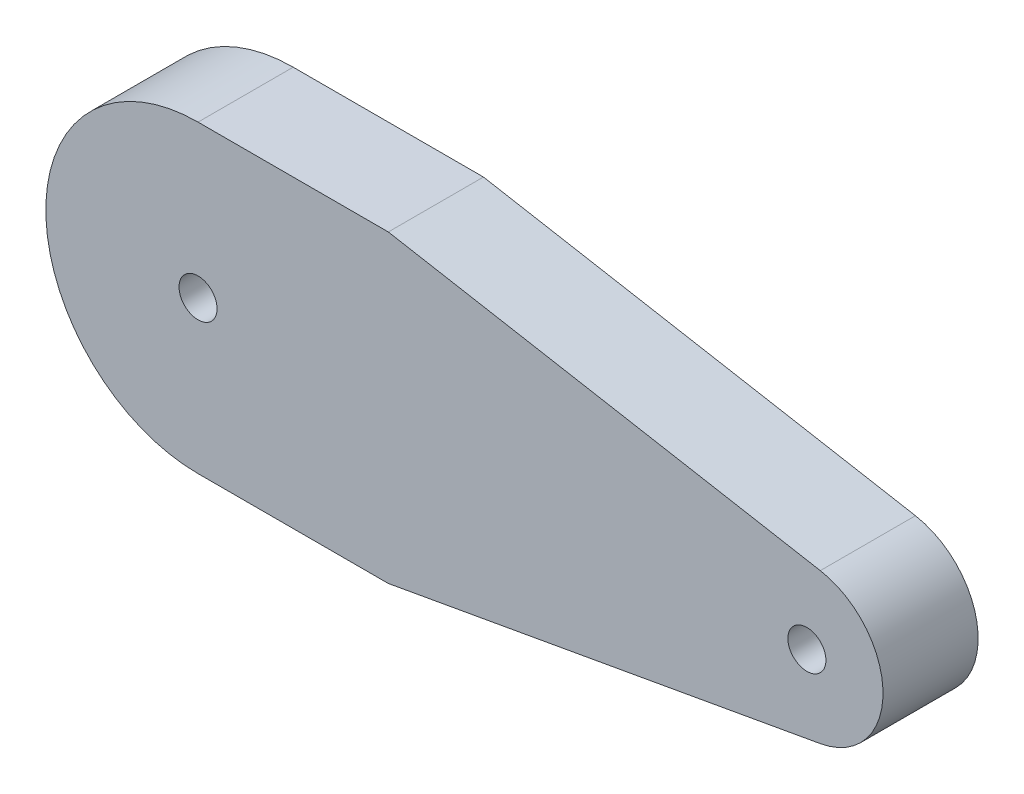
ISO-10303-21;
HEADER;
FILE_DESCRIPTION(('STEP AP214'),'2;1');
FILE_NAME('part.step','',(''),(''),'','','');
FILE_SCHEMA(('AUTOMOTIVE_DESIGN { 1 0 10303 214 1 1 1 1 }'));
ENDSEC;
DATA;
#1=APPLICATION_CONTEXT('core data for automotive mechanical design processes');
#2=APPLICATION_PROTOCOL_DEFINITION('international standard','automotive_design',2000,#1);
#3=PRODUCT_CONTEXT('',#1,'mechanical');
#4=PRODUCT('Part','Part','',(#3));
#5=PRODUCT_RELATED_PRODUCT_CATEGORY('part','',(#4));
#6=PRODUCT_DEFINITION_FORMATION('','',#4);
#7=PRODUCT_DEFINITION_CONTEXT('part definition',#1,'design');
#8=PRODUCT_DEFINITION('design','',#6,#7);
#9=PRODUCT_DEFINITION_SHAPE('','',#8);
#10=(LENGTH_UNIT() NAMED_UNIT(*) SI_UNIT(.MILLI.,.METRE.));
#11=(NAMED_UNIT(*) PLANE_ANGLE_UNIT() SI_UNIT($,.RADIAN.));
#12=(NAMED_UNIT(*) SI_UNIT($,.STERADIAN.) SOLID_ANGLE_UNIT());
#13=UNCERTAINTY_MEASURE_WITH_UNIT(LENGTH_MEASURE(1.E-05),#10,'distance_accuracy_value','');
#14=(GEOMETRIC_REPRESENTATION_CONTEXT(3) GLOBAL_UNCERTAINTY_ASSIGNED_CONTEXT((#13)) GLOBAL_UNIT_ASSIGNED_CONTEXT((#10,
#11,#12)) REPRESENTATION_CONTEXT('',''));
#15=CARTESIAN_POINT('',(0.,0.,0.));
#16=DIRECTION('',(0.,0.,1.));
#17=DIRECTION('',(1.,0.,0.));
#18=AXIS2_PLACEMENT_3D('',#15,#16,#17);
#19=CARTESIAN_POINT('',(0.,0.,50.));
#20=DIRECTION('',(0.,0.,-1.));
#21=DIRECTION('',(-1.,0.,0.));
#22=AXIS2_PLACEMENT_3D('',#19,#20,#21);
#23=CYLINDRICAL_SURFACE('',#22,80.);
#24=CARTESIAN_POINT('',(0.,0.,0.));
#25=DIRECTION('',(0.,0.,1.));
#26=DIRECTION('',(1.,0.,0.));
#27=AXIS2_PLACEMENT_3D('',#24,#25,#26);
#28=CIRCLE('',#27,80.);
#29=CARTESIAN_POINT('',(0.,80.,0.));
#30=VERTEX_POINT('',#29);
#31=CARTESIAN_POINT('',(0.,-80.,0.));
#32=VERTEX_POINT('',#31);
#33=EDGE_CURVE('E120',#30,#32,#28,.T.);
#34=ORIENTED_EDGE('',*,*,#33,.T.);
#35=DIRECTION('',(0.,0.,-1.));
#36=VECTOR('',#35,1.);
#37=CARTESIAN_POINT('',(0.,-80.,50.));
#38=LINE('',#37,#36);
#39=CARTESIAN_POINT('',(0.,-80.,50.));
#40=VERTEX_POINT('',#39);
#41=EDGE_CURVE('E11',#40,#32,#38,.T.);
#42=ORIENTED_EDGE('',*,*,#41,.F.);
#43=CARTESIAN_POINT('',(0.,0.,50.));
#44=DIRECTION('',(0.,0.,1.));
#45=DIRECTION('',(1.,0.,0.));
#46=AXIS2_PLACEMENT_3D('',#43,#44,#45);
#47=CIRCLE('',#46,80.);
#48=CARTESIAN_POINT('',(0.,80.,50.));
#49=VERTEX_POINT('',#48);
#50=EDGE_CURVE('E131',#49,#40,#47,.T.);
#51=ORIENTED_EDGE('',*,*,#50,.F.);
#52=DIRECTION('',(0.,0.,-1.));
#53=VECTOR('',#52,1.);
#54=CARTESIAN_POINT('',(0.,80.,50.));
#55=LINE('',#54,#53);
#56=EDGE_CURVE('E116',#49,#30,#55,.T.);
#57=ORIENTED_EDGE('',*,*,#56,.T.);
#58=EDGE_LOOP('',(#34,#42,#51,#57));
#59=FACE_BOUND('',#58,.T.);
#60=ADVANCED_FACE('F36',(#59),#23,.T.);
#61=CARTESIAN_POINT('',(0.,-80.,50.));
#62=DIRECTION('',(0.,1.,0.));
#63=DIRECTION('',(0.,0.,1.));
#64=AXIS2_PLACEMENT_3D('',#61,#62,#63);
#65=PLANE('',#64);
#66=DIRECTION('',(1.,0.,0.));
#67=VECTOR('',#66,1.);
#68=CARTESIAN_POINT('',(0.,-80.,0.));
#69=LINE('',#68,#67);
#70=CARTESIAN_POINT('',(100.,-80.,0.));
#71=VERTEX_POINT('',#70);
#72=EDGE_CURVE('E123',#32,#71,#69,.T.);
#73=ORIENTED_EDGE('',*,*,#72,.T.);
#74=DIRECTION('',(0.,0.,-1.));
#75=VECTOR('',#74,1.);
#76=CARTESIAN_POINT('',(100.,-80.,50.));
#77=LINE('',#76,#75);
#78=CARTESIAN_POINT('',(100.,-80.,50.));
#79=VERTEX_POINT('',#78);
#80=EDGE_CURVE('E44',#79,#71,#77,.T.);
#81=ORIENTED_EDGE('',*,*,#80,.F.);
#82=DIRECTION('',(1.,0.,0.));
#83=VECTOR('',#82,1.);
#84=CARTESIAN_POINT('',(0.,-80.,50.));
#85=LINE('',#84,#83);
#86=EDGE_CURVE('E89',#40,#79,#85,.T.);
#87=ORIENTED_EDGE('',*,*,#86,.F.);
#88=ORIENTED_EDGE('',*,*,#41,.T.);
#89=EDGE_LOOP('',(#73,#81,#87,#88));
#90=FACE_BOUND('',#89,.T.);
#91=ADVANCED_FACE('F156',(#90),#65,.F.);
#92=CARTESIAN_POINT('',(100.,-80.,50.));
#93=DIRECTION('',(-0.176133214442943,0.984366339718093,0.));
#94=DIRECTION('',(-0.984366339718093,-0.176133214442943,0.));
#95=AXIS2_PLACEMENT_3D('',#92,#93,#94);
#96=PLANE('',#95);
#97=DIRECTION('',(0.984366339718093,0.176133214442943,0.));
#98=VECTOR('',#97,1.);
#99=CARTESIAN_POINT('',(100.,-80.,0.));
#100=LINE('',#99,#98);
#101=CARTESIAN_POINT('',(327.045328577718,-39.3746535887237,0.));
#102=VERTEX_POINT('',#101);
#103=EDGE_CURVE('E126',#71,#102,#100,.T.);
#104=ORIENTED_EDGE('',*,*,#103,.T.);
#105=DIRECTION('',(0.,0.,-1.));
#106=VECTOR('',#105,1.);
#107=CARTESIAN_POINT('',(327.045328577718,-39.3746535887237,50.));
#108=LINE('',#107,#106);
#109=CARTESIAN_POINT('',(327.045328577718,-39.3746535887237,50.));
#110=VERTEX_POINT('',#109);
#111=EDGE_CURVE('E111',#110,#102,#108,.T.);
#112=ORIENTED_EDGE('',*,*,#111,.F.);
#113=DIRECTION('',(0.984366339718093,0.176133214442943,0.));
#114=VECTOR('',#113,1.);
#115=CARTESIAN_POINT('',(100.,-80.,50.));
#116=LINE('',#115,#114);
#117=EDGE_CURVE('E102',#79,#110,#116,.T.);
#118=ORIENTED_EDGE('',*,*,#117,.F.);
#119=ORIENTED_EDGE('',*,*,#80,.T.);
#120=EDGE_LOOP('',(#104,#112,#118,#119));
#121=FACE_BOUND('',#120,.T.);
#122=ADVANCED_FACE('F137',(#121),#96,.F.);
#123=CARTESIAN_POINT('',(320.,0.,50.));
#124=DIRECTION('',(0.,0.,-1.));
#125=DIRECTION('',(-1.,0.,0.));
#126=AXIS2_PLACEMENT_3D('',#123,#124,#125);
#127=CYLINDRICAL_SURFACE('',#126,40.);
#128=CARTESIAN_POINT('',(320.,0.,0.));
#129=DIRECTION('',(0.,0.,1.));
#130=DIRECTION('',(1.,0.,0.));
#131=AXIS2_PLACEMENT_3D('',#128,#129,#130);
#132=CIRCLE('',#131,40.);
#133=CARTESIAN_POINT('',(327.045328577718,39.3746535887237,0.));
#134=VERTEX_POINT('',#133);
#135=EDGE_CURVE('E110',#102,#134,#132,.T.);
#136=ORIENTED_EDGE('',*,*,#135,.T.);
#137=DIRECTION('',(0.,0.,-1.));
#138=VECTOR('',#137,1.);
#139=CARTESIAN_POINT('',(327.045328577718,39.3746535887237,50.));
#140=LINE('',#139,#138);
#141=CARTESIAN_POINT('',(327.045328577718,39.3746535887237,50.));
#142=VERTEX_POINT('',#141);
#143=EDGE_CURVE('E107',#142,#134,#140,.T.);
#144=ORIENTED_EDGE('',*,*,#143,.F.);
#145=CARTESIAN_POINT('',(320.,0.,50.));
#146=DIRECTION('',(0.,0.,1.));
#147=DIRECTION('',(1.,0.,0.));
#148=AXIS2_PLACEMENT_3D('',#145,#146,#147);
#149=CIRCLE('',#148,40.);
#150=EDGE_CURVE('E96',#110,#142,#149,.T.);
#151=ORIENTED_EDGE('',*,*,#150,.F.);
#152=ORIENTED_EDGE('',*,*,#111,.T.);
#153=EDGE_LOOP('',(#136,#144,#151,#152));
#154=FACE_BOUND('',#153,.T.);
#155=ADVANCED_FACE('F108',(#154),#127,.T.);
#156=CARTESIAN_POINT('',(100.,80.,50.));
#157=DIRECTION('',(-0.176133214442943,-0.984366339718093,0.));
#158=DIRECTION('',(0.984366339718093,-0.176133214442943,0.));
#159=AXIS2_PLACEMENT_3D('',#156,#157,#158);
#160=PLANE('',#159);
#161=DIRECTION('',(-0.984366339718093,0.176133214442943,0.));
#162=VECTOR('',#161,1.);
#163=CARTESIAN_POINT('',(100.,80.,0.));
#164=LINE('',#163,#162);
#165=CARTESIAN_POINT('',(100.,80.,0.));
#166=VERTEX_POINT('',#165);
#167=EDGE_CURVE('E75',#134,#166,#164,.T.);
#168=ORIENTED_EDGE('',*,*,#167,.T.);
#169=DIRECTION('',(0.,0.,-1.));
#170=VECTOR('',#169,1.);
#171=CARTESIAN_POINT('',(100.,80.,50.));
#172=LINE('',#171,#170);
#173=CARTESIAN_POINT('',(100.,80.,50.));
#174=VERTEX_POINT('',#173);
#175=EDGE_CURVE('E112',#174,#166,#172,.T.);
#176=ORIENTED_EDGE('',*,*,#175,.F.);
#177=DIRECTION('',(-0.984366339718093,0.176133214442943,0.));
#178=VECTOR('',#177,1.);
#179=CARTESIAN_POINT('',(100.,80.,50.));
#180=LINE('',#179,#178);
#181=EDGE_CURVE('E100',#142,#174,#180,.T.);
#182=ORIENTED_EDGE('',*,*,#181,.F.);
#183=ORIENTED_EDGE('',*,*,#143,.T.);
#184=EDGE_LOOP('',(#168,#176,#182,#183));
#185=FACE_BOUND('',#184,.T.);
#186=ADVANCED_FACE('F114',(#185),#160,.F.);
#187=CARTESIAN_POINT('',(0.,80.,50.));
#188=DIRECTION('',(0.,-1.,0.));
#189=DIRECTION('',(0.,0.,-1.));
#190=AXIS2_PLACEMENT_3D('',#187,#188,#189);
#191=PLANE('',#190);
#192=DIRECTION('',(-1.,0.,0.));
#193=VECTOR('',#192,1.);
#194=CARTESIAN_POINT('',(0.,80.,0.));
#195=LINE('',#194,#193);
#196=EDGE_CURVE('E81',#166,#30,#195,.T.);
#197=ORIENTED_EDGE('',*,*,#196,.T.);
#198=ORIENTED_EDGE('',*,*,#56,.F.);
#199=DIRECTION('',(-1.,0.,0.));
#200=VECTOR('',#199,1.);
#201=CARTESIAN_POINT('',(0.,80.,50.));
#202=LINE('',#201,#200);
#203=EDGE_CURVE('E52',#174,#49,#202,.T.);
#204=ORIENTED_EDGE('',*,*,#203,.F.);
#205=ORIENTED_EDGE('',*,*,#175,.T.);
#206=EDGE_LOOP('',(#197,#198,#204,#205));
#207=FACE_BOUND('',#206,.T.);
#208=ADVANCED_FACE('F144',(#207),#191,.F.);
#209=CARTESIAN_POINT('',(0.,0.,50.));
#210=DIRECTION('',(0.,0.,1.));
#211=DIRECTION('',(1.,0.,0.));
#212=AXIS2_PLACEMENT_3D('',#209,#210,#211);
#213=PLANE('',#212);
#214=CARTESIAN_POINT('',(320.,0.,50.));
#215=DIRECTION('',(0.,0.,1.));
#216=DIRECTION('',(1.,0.,0.));
#217=AXIS2_PLACEMENT_3D('',#214,#215,#216);
#218=CIRCLE('',#217,9.99999999999998);
#219=CARTESIAN_POINT('',(330.,0.,50.));
#220=VERTEX_POINT('',#219);
#221=EDGE_CURVE('E240',#220,#220,#218,.T.);
#222=ORIENTED_EDGE('',*,*,#221,.F.);
#223=EDGE_LOOP('',(#222));
#224=FACE_BOUND('',#223,.T.);
#225=CARTESIAN_POINT('',(0.,0.,50.));
#226=DIRECTION('',(0.,0.,1.));
#227=DIRECTION('',(1.,0.,0.));
#228=AXIS2_PLACEMENT_3D('',#225,#226,#227);
#229=CIRCLE('',#228,10.);
#230=CARTESIAN_POINT('',(10.,0.,50.));
#231=VERTEX_POINT('',#230);
#232=EDGE_CURVE('E239',#231,#231,#229,.T.);
#233=ORIENTED_EDGE('',*,*,#232,.F.);
#234=EDGE_LOOP('',(#233));
#235=FACE_BOUND('',#234,.T.);
#236=ORIENTED_EDGE('',*,*,#50,.T.);
#237=ORIENTED_EDGE('',*,*,#86,.T.);
#238=ORIENTED_EDGE('',*,*,#117,.T.);
#239=ORIENTED_EDGE('',*,*,#150,.T.);
#240=ORIENTED_EDGE('',*,*,#181,.T.);
#241=ORIENTED_EDGE('',*,*,#203,.T.);
#242=EDGE_LOOP('',(#236,#237,#238,#239,#240,#241));
#243=FACE_BOUND('',#242,.T.);
#244=ADVANCED_FACE('F98',(#224,#235,#243),#213,.T.);
#245=CARTESIAN_POINT('',(0.,0.,0.));
#246=DIRECTION('',(0.,0.,1.));
#247=DIRECTION('',(1.,0.,0.));
#248=AXIS2_PLACEMENT_3D('',#245,#246,#247);
#249=PLANE('',#248);
#250=ORIENTED_EDGE('',*,*,#33,.F.);
#251=ORIENTED_EDGE('',*,*,#196,.F.);
#252=ORIENTED_EDGE('',*,*,#167,.F.);
#253=ORIENTED_EDGE('',*,*,#135,.F.);
#254=ORIENTED_EDGE('',*,*,#103,.F.);
#255=ORIENTED_EDGE('',*,*,#72,.F.);
#256=EDGE_LOOP('',(#250,#251,#252,#253,#254,#255));
#257=FACE_BOUND('',#256,.T.);
#258=ADVANCED_FACE('F140',(#257),#249,.F.);
#259=CARTESIAN_POINT('',(0.,0.,30.));
#260=DIRECTION('',(0.,0.,1.));
#261=DIRECTION('',(1.,0.,0.));
#262=AXIS2_PLACEMENT_3D('',#259,#260,#261);
#263=CYLINDRICAL_SURFACE('',#262,10.);
#264=CARTESIAN_POINT('',(0.,0.,30.));
#265=DIRECTION('',(0.,0.,1.));
#266=DIRECTION('',(1.,0.,0.));
#267=AXIS2_PLACEMENT_3D('',#264,#265,#266);
#268=CIRCLE('',#267,10.);
#269=CARTESIAN_POINT('',(10.,0.,30.));
#270=VERTEX_POINT('',#269);
#271=EDGE_CURVE('E124',#270,#270,#268,.T.);
#272=ORIENTED_EDGE('',*,*,#271,.F.);
#273=EDGE_LOOP('',(#272));
#274=FACE_BOUND('',#273,.T.);
#275=ORIENTED_EDGE('',*,*,#232,.T.);
#276=EDGE_LOOP('',(#275));
#277=FACE_BOUND('',#276,.T.);
#278=ADVANCED_FACE('F188',(#274,#277),#263,.F.);
#279=CARTESIAN_POINT('',(0.,0.,30.));
#280=DIRECTION('',(0.,0.,1.));
#281=DIRECTION('',(1.,0.,0.));
#282=AXIS2_PLACEMENT_3D('',#279,#280,#281);
#283=PLANE('',#282);
#284=ORIENTED_EDGE('',*,*,#271,.T.);
#285=EDGE_LOOP('',(#284));
#286=FACE_BOUND('',#285,.T.);
#287=ADVANCED_FACE('F202',(#286),#283,.T.);
#288=CARTESIAN_POINT('',(320.,0.,30.));
#289=DIRECTION('',(0.,0.,1.));
#290=DIRECTION('',(1.,0.,0.));
#291=AXIS2_PLACEMENT_3D('',#288,#289,#290);
#292=CYLINDRICAL_SURFACE('',#291,9.99999999999998);
#293=CARTESIAN_POINT('',(320.,0.,30.));
#294=DIRECTION('',(0.,0.,1.));
#295=DIRECTION('',(1.,0.,0.));
#296=AXIS2_PLACEMENT_3D('',#293,#294,#295);
#297=CIRCLE('',#296,9.99999999999998);
#298=CARTESIAN_POINT('',(330.,0.,30.));
#299=VERTEX_POINT('',#298);
#300=EDGE_CURVE('E238',#299,#299,#297,.T.);
#301=ORIENTED_EDGE('',*,*,#300,.F.);
#302=EDGE_LOOP('',(#301));
#303=FACE_BOUND('',#302,.T.);
#304=ORIENTED_EDGE('',*,*,#221,.T.);
#305=EDGE_LOOP('',(#304));
#306=FACE_BOUND('',#305,.T.);
#307=ADVANCED_FACE('F212',(#303,#306),#292,.F.);
#308=CARTESIAN_POINT('',(320.,0.,30.));
#309=DIRECTION('',(0.,0.,1.));
#310=DIRECTION('',(1.,0.,0.));
#311=AXIS2_PLACEMENT_3D('',#308,#309,#310);
#312=PLANE('',#311);
#313=ORIENTED_EDGE('',*,*,#300,.T.);
#314=EDGE_LOOP('',(#313));
#315=FACE_BOUND('',#314,.T.);
#316=ADVANCED_FACE('F222',(#315),#312,.T.);
#317=CLOSED_SHELL('',(#60,#91,#122,#155,#186,#208,#244,#258,#278,#287,#307,#316));
#318=MANIFOLD_SOLID_BREP('B2',#317);
#319=ADVANCED_BREP_SHAPE_REPRESENTATION('',(#18,#318),#14);
#320=SHAPE_DEFINITION_REPRESENTATION(#9,#319);
ENDSEC;
END-ISO-10303-21;
